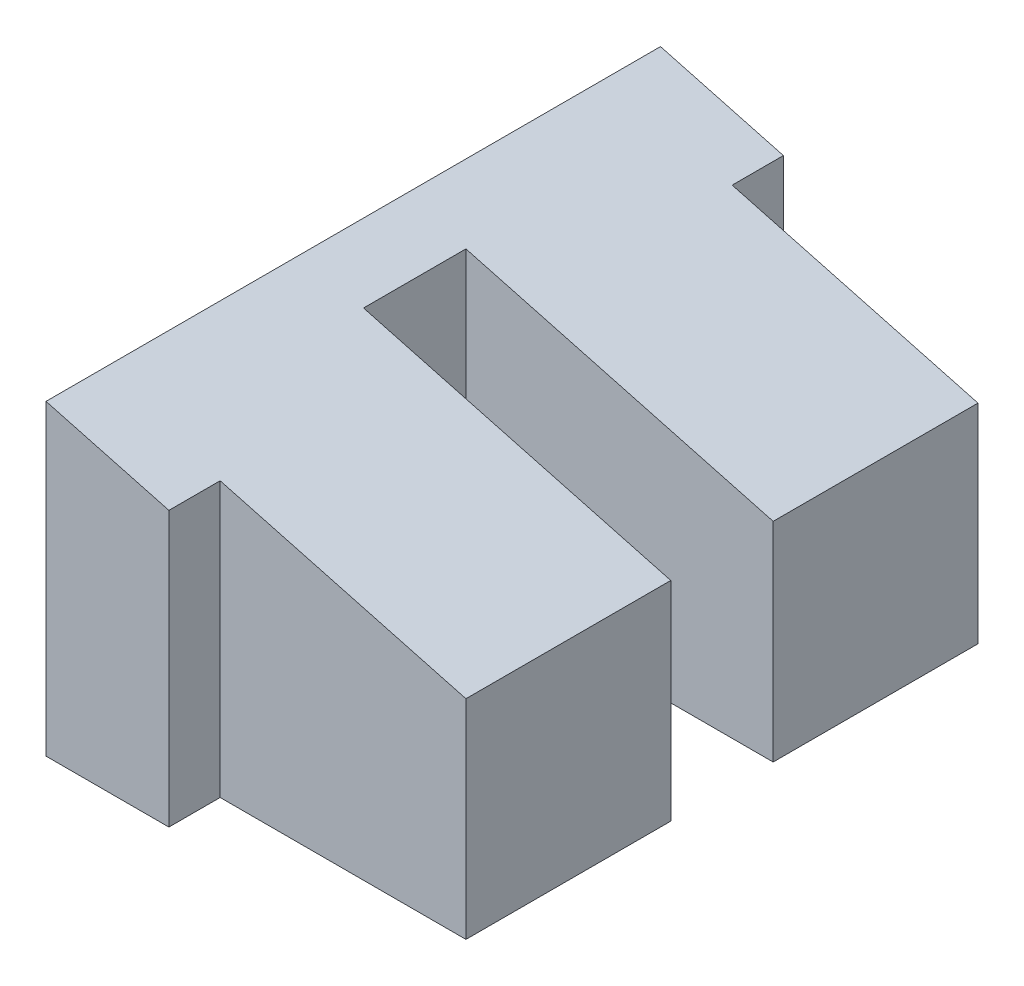
ISO-10303-21;
HEADER;
FILE_DESCRIPTION(('STEP AP214'),'2;1');
FILE_NAME('part.step','',(''),(''),'','','');
FILE_SCHEMA(('AUTOMOTIVE_DESIGN { 1 0 10303 214 1 1 1 1 }'));
ENDSEC;
DATA;
#1=APPLICATION_CONTEXT('core data for automotive mechanical design processes');
#2=APPLICATION_PROTOCOL_DEFINITION('international standard','automotive_design',2000,#1);
#3=PRODUCT_CONTEXT('',#1,'mechanical');
#4=PRODUCT('Part','Part','',(#3));
#5=PRODUCT_RELATED_PRODUCT_CATEGORY('part','',(#4));
#6=PRODUCT_DEFINITION_FORMATION('','',#4);
#7=PRODUCT_DEFINITION_CONTEXT('part definition',#1,'design');
#8=PRODUCT_DEFINITION('design','',#6,#7);
#9=PRODUCT_DEFINITION_SHAPE('','',#8);
#10=(LENGTH_UNIT() NAMED_UNIT(*) SI_UNIT(.MILLI.,.METRE.));
#11=(NAMED_UNIT(*) PLANE_ANGLE_UNIT() SI_UNIT($,.RADIAN.));
#12=(NAMED_UNIT(*) SI_UNIT($,.STERADIAN.) SOLID_ANGLE_UNIT());
#13=UNCERTAINTY_MEASURE_WITH_UNIT(LENGTH_MEASURE(1.E-05),#10,'distance_accuracy_value','');
#14=(GEOMETRIC_REPRESENTATION_CONTEXT(3) GLOBAL_UNCERTAINTY_ASSIGNED_CONTEXT((#13)) GLOBAL_UNIT_ASSIGNED_CONTEXT((#10,
#11,#12)) REPRESENTATION_CONTEXT('',''));
#15=CARTESIAN_POINT('',(0.,0.,0.));
#16=DIRECTION('',(0.,0.,1.));
#17=DIRECTION('',(1.,0.,0.));
#18=AXIS2_PLACEMENT_3D('',#15,#16,#17);
#19=CARTESIAN_POINT('',(10.,0.,0.));
#20=DIRECTION('',(1.,0.,0.));
#21=DIRECTION('',(0.,0.,-1.));
#22=AXIS2_PLACEMENT_3D('',#19,#20,#21);
#23=PLANE('',#22);
#24=DIRECTION('',(0.,1.,0.));
#25=VECTOR('',#24,1.);
#26=CARTESIAN_POINT('',(10.,25.,-25.));
#27=LINE('',#26,#25);
#28=CARTESIAN_POINT('',(10.,0.,-25.));
#29=VERTEX_POINT('',#28);
#30=CARTESIAN_POINT('',(10.,22.3205080756888,-25.));
#31=VERTEX_POINT('',#30);
#32=EDGE_CURVE('E204',#29,#31,#27,.T.);
#33=ORIENTED_EDGE('',*,*,#32,.T.);
#34=DIRECTION('',(0.,0.,1.));
#35=VECTOR('',#34,1.);
#36=CARTESIAN_POINT('',(10.,22.3205080756888,0.));
#37=LINE('',#36,#35);
#38=CARTESIAN_POINT('',(10.,22.3205080756888,-20.835));
#39=VERTEX_POINT('',#38);
#40=EDGE_CURVE('E157',#31,#39,#37,.T.);
#41=ORIENTED_EDGE('',*,*,#40,.T.);
#42=DIRECTION('',(0.,1.,0.));
#43=VECTOR('',#42,1.);
#44=CARTESIAN_POINT('',(10.,25.,-20.835));
#45=LINE('',#44,#43);
#46=CARTESIAN_POINT('',(10.,0.,-20.835));
#47=VERTEX_POINT('',#46);
#48=EDGE_CURVE('E174',#47,#39,#45,.T.);
#49=ORIENTED_EDGE('',*,*,#48,.F.);
#50=DIRECTION('',(0.,0.,-1.));
#51=VECTOR('',#50,1.);
#52=CARTESIAN_POINT('',(10.,0.,25.));
#53=LINE('',#52,#51);
#54=EDGE_CURVE('E199',#47,#29,#53,.T.);
#55=ORIENTED_EDGE('',*,*,#54,.T.);
#56=EDGE_LOOP('',(#33,#41,#49,#55));
#57=FACE_BOUND('',#56,.T.);
#58=ADVANCED_FACE('F36',(#57),#23,.T.);
#59=DIRECTION('',(0.,-1.,0.));
#60=VECTOR('',#59,1.);
#61=CARTESIAN_POINT('',(10.,25.,20.83));
#62=LINE('',#61,#60);
#63=CARTESIAN_POINT('',(10.,22.3205080756888,20.83));
#64=VERTEX_POINT('',#63);
#65=CARTESIAN_POINT('',(10.,0.,20.83));
#66=VERTEX_POINT('',#65);
#67=EDGE_CURVE('E187',#64,#66,#62,.T.);
#68=ORIENTED_EDGE('',*,*,#67,.F.);
#69=DIRECTION('',(0.,0.,1.));
#70=VECTOR('',#69,1.);
#71=CARTESIAN_POINT('',(10.,22.3205080756888,0.));
#72=LINE('',#71,#70);
#73=CARTESIAN_POINT('',(10.,22.3205080756888,25.));
#74=VERTEX_POINT('',#73);
#75=EDGE_CURVE('E59',#64,#74,#72,.T.);
#76=ORIENTED_EDGE('',*,*,#75,.T.);
#77=DIRECTION('',(0.,-1.,0.));
#78=VECTOR('',#77,1.);
#79=CARTESIAN_POINT('',(10.,25.,25.));
#80=LINE('',#79,#78);
#81=CARTESIAN_POINT('',(10.,0.,25.));
#82=VERTEX_POINT('',#81);
#83=EDGE_CURVE('E197',#74,#82,#80,.T.);
#84=ORIENTED_EDGE('',*,*,#83,.T.);
#85=EDGE_CURVE('E201',#82,#66,#53,.T.);
#86=ORIENTED_EDGE('',*,*,#85,.T.);
#87=EDGE_LOOP('',(#68,#76,#84,#86));
#88=FACE_BOUND('',#87,.T.);
#89=ADVANCED_FACE('F244',(#88),#23,.T.);
#90=CARTESIAN_POINT('',(10.,25.,25.));
#91=DIRECTION('',(0.,0.,-1.));
#92=DIRECTION('',(0.,1.,0.));
#93=AXIS2_PLACEMENT_3D('',#90,#91,#92);
#94=PLANE('',#93);
#95=DIRECTION('',(0.96592582628907,-0.258819045102514,0.));
#96=VECTOR('',#95,1.);
#97=CARTESIAN_POINT('',(9.33012701892223,22.5000000000001,25.));
#98=LINE('',#97,#96);
#99=CARTESIAN_POINT('',(0.,25.,25.));
#100=VERTEX_POINT('',#99);
#101=EDGE_CURVE('E171',#100,#74,#98,.T.);
#102=ORIENTED_EDGE('',*,*,#101,.F.);
#103=DIRECTION('',(0.,-1.,0.));
#104=VECTOR('',#103,1.);
#105=CARTESIAN_POINT('',(0.,25.,25.));
#106=LINE('',#105,#104);
#107=CARTESIAN_POINT('',(0.,0.,25.));
#108=VERTEX_POINT('',#107);
#109=EDGE_CURVE('E196',#100,#108,#106,.T.);
#110=ORIENTED_EDGE('',*,*,#109,.T.);
#111=DIRECTION('',(-1.,0.,0.));
#112=VECTOR('',#111,1.);
#113=CARTESIAN_POINT('',(10.,0.,25.));
#114=LINE('',#113,#112);
#115=EDGE_CURVE('E218',#82,#108,#114,.T.);
#116=ORIENTED_EDGE('',*,*,#115,.F.);
#117=ORIENTED_EDGE('',*,*,#83,.F.);
#118=EDGE_LOOP('',(#102,#110,#116,#117));
#119=FACE_BOUND('',#118,.T.);
#120=ADVANCED_FACE('F38',(#119),#94,.F.);
#121=CARTESIAN_POINT('',(10.,25.,-25.));
#122=DIRECTION('',(0.,0.,1.));
#123=DIRECTION('',(0.,-1.,0.));
#124=AXIS2_PLACEMENT_3D('',#121,#122,#123);
#125=PLANE('',#124);
#126=DIRECTION('',(-0.96592582628907,0.258819045102514,0.));
#127=VECTOR('',#126,1.);
#128=CARTESIAN_POINT('',(9.33012701892222,22.5000000000001,-25.));
#129=LINE('',#128,#127);
#130=CARTESIAN_POINT('',(0.,25.,-25.));
#131=VERTEX_POINT('',#130);
#132=EDGE_CURVE('E160',#31,#131,#129,.T.);
#133=ORIENTED_EDGE('',*,*,#132,.F.);
#134=ORIENTED_EDGE('',*,*,#32,.F.);
#135=DIRECTION('',(-1.,0.,0.));
#136=VECTOR('',#135,1.);
#137=CARTESIAN_POINT('',(10.,0.,-25.));
#138=LINE('',#137,#136);
#139=CARTESIAN_POINT('',(0.,0.,-25.));
#140=VERTEX_POINT('',#139);
#141=EDGE_CURVE('E207',#29,#140,#138,.T.);
#142=ORIENTED_EDGE('',*,*,#141,.T.);
#143=DIRECTION('',(0.,1.,0.));
#144=VECTOR('',#143,1.);
#145=CARTESIAN_POINT('',(0.,25.,-25.));
#146=LINE('',#145,#144);
#147=EDGE_CURVE('E212',#140,#131,#146,.T.);
#148=ORIENTED_EDGE('',*,*,#147,.T.);
#149=EDGE_LOOP('',(#133,#134,#142,#148));
#150=FACE_BOUND('',#149,.T.);
#151=ADVANCED_FACE('F235',(#150),#125,.F.);
#152=CARTESIAN_POINT('',(30.,25.,20.83));
#153=DIRECTION('',(0.,0.,-1.));
#154=DIRECTION('',(0.,1.,0.));
#155=AXIS2_PLACEMENT_3D('',#152,#153,#154);
#156=PLANE('',#155);
#157=DIRECTION('',(0.96592582628907,-0.258819045102514,0.));
#158=VECTOR('',#157,1.);
#159=CARTESIAN_POINT('',(27.9903810567667,17.5000000000002,20.83));
#160=LINE('',#159,#158);
#161=CARTESIAN_POINT('',(30.,16.9615242270665,20.83));
#162=VERTEX_POINT('',#161);
#163=EDGE_CURVE('E167',#64,#162,#160,.T.);
#164=ORIENTED_EDGE('',*,*,#163,.F.);
#165=ORIENTED_EDGE('',*,*,#67,.T.);
#166=DIRECTION('',(-1.,0.,0.));
#167=VECTOR('',#166,1.);
#168=CARTESIAN_POINT('',(30.,0.,20.83));
#169=LINE('',#168,#167);
#170=CARTESIAN_POINT('',(30.,0.,20.83));
#171=VERTEX_POINT('',#170);
#172=EDGE_CURVE('E136',#171,#66,#169,.T.);
#173=ORIENTED_EDGE('',*,*,#172,.F.);
#174=DIRECTION('',(0.,-1.,0.));
#175=VECTOR('',#174,1.);
#176=CARTESIAN_POINT('',(30.,25.,20.83));
#177=LINE('',#176,#175);
#178=EDGE_CURVE('E188',#162,#171,#177,.T.);
#179=ORIENTED_EDGE('',*,*,#178,.F.);
#180=EDGE_LOOP('',(#164,#165,#173,#179));
#181=FACE_BOUND('',#180,.T.);
#182=ADVANCED_FACE('F248',(#181),#156,.F.);
#183=CARTESIAN_POINT('',(30.,25.,4.16333333333334));
#184=DIRECTION('',(0.,0.,1.));
#185=DIRECTION('',(0.,-1.,0.));
#186=AXIS2_PLACEMENT_3D('',#183,#184,#185);
#187=PLANE('',#186);
#188=DIRECTION('',(-0.96592582628907,0.258819045102514,0.));
#189=VECTOR('',#188,1.);
#190=CARTESIAN_POINT('',(27.9903810567667,17.5000000000002,4.16333333333334));
#191=LINE('',#190,#189);
#192=CARTESIAN_POINT('',(30.,16.9615242270665,4.16333333333334));
#193=VERTEX_POINT('',#192);
#194=CARTESIAN_POINT('',(5.,23.6602540378444,4.16333333333335));
#195=VERTEX_POINT('',#194);
#196=EDGE_CURVE('E51',#193,#195,#191,.T.);
#197=ORIENTED_EDGE('',*,*,#196,.F.);
#198=DIRECTION('',(0.,1.,0.));
#199=VECTOR('',#198,1.);
#200=CARTESIAN_POINT('',(30.,25.,4.16333333333334));
#201=LINE('',#200,#199);
#202=CARTESIAN_POINT('',(30.,0.,4.16333333333333));
#203=VERTEX_POINT('',#202);
#204=EDGE_CURVE('E132',#203,#193,#201,.T.);
#205=ORIENTED_EDGE('',*,*,#204,.F.);
#206=DIRECTION('',(-1.,0.,0.));
#207=VECTOR('',#206,1.);
#208=CARTESIAN_POINT('',(30.,0.,4.16333333333333));
#209=LINE('',#208,#207);
#210=CARTESIAN_POINT('',(5.,0.,4.16333333333334));
#211=VERTEX_POINT('',#210);
#212=EDGE_CURVE('E127',#203,#211,#209,.T.);
#213=ORIENTED_EDGE('',*,*,#212,.T.);
#214=DIRECTION('',(0.,-1.,0.));
#215=VECTOR('',#214,1.);
#216=CARTESIAN_POINT('',(5.,25.,4.16333333333334));
#217=LINE('',#216,#215);
#218=EDGE_CURVE('E130',#195,#211,#217,.T.);
#219=ORIENTED_EDGE('',*,*,#218,.F.);
#220=EDGE_LOOP('',(#197,#205,#213,#219));
#221=FACE_BOUND('',#220,.T.);
#222=ADVANCED_FACE('F129',(#221),#187,.F.);
#223=CARTESIAN_POINT('',(30.,25.,-4.16833333333333));
#224=DIRECTION('',(0.,0.,-1.));
#225=DIRECTION('',(0.,1.,0.));
#226=AXIS2_PLACEMENT_3D('',#223,#224,#225);
#227=PLANE('',#226);
#228=DIRECTION('',(0.96592582628907,-0.258819045102514,0.));
#229=VECTOR('',#228,1.);
#230=CARTESIAN_POINT('',(27.9903810567667,17.5000000000002,-4.16833333333333));
#231=LINE('',#230,#229);
#232=CARTESIAN_POINT('',(5.,23.6602540378444,-4.16833333333333));
#233=VERTEX_POINT('',#232);
#234=CARTESIAN_POINT('',(30.,16.9615242270665,-4.16833333333333));
#235=VERTEX_POINT('',#234);
#236=EDGE_CURVE('E163',#233,#235,#231,.T.);
#237=ORIENTED_EDGE('',*,*,#236,.F.);
#238=DIRECTION('',(0.,-1.,0.));
#239=VECTOR('',#238,1.);
#240=CARTESIAN_POINT('',(5.,25.,-4.16833333333333));
#241=LINE('',#240,#239);
#242=CARTESIAN_POINT('',(5.,0.,-4.16833333333333));
#243=VERTEX_POINT('',#242);
#244=EDGE_CURVE('E143',#233,#243,#241,.T.);
#245=ORIENTED_EDGE('',*,*,#244,.T.);
#246=DIRECTION('',(-1.,0.,0.));
#247=VECTOR('',#246,1.);
#248=CARTESIAN_POINT('',(30.,0.,-4.16833333333333));
#249=LINE('',#248,#247);
#250=CARTESIAN_POINT('',(30.,0.,-4.16833333333333));
#251=VERTEX_POINT('',#250);
#252=EDGE_CURVE('E148',#251,#243,#249,.T.);
#253=ORIENTED_EDGE('',*,*,#252,.F.);
#254=DIRECTION('',(0.,-1.,0.));
#255=VECTOR('',#254,1.);
#256=CARTESIAN_POINT('',(30.,25.,-4.16833333333333));
#257=LINE('',#256,#255);
#258=EDGE_CURVE('E175',#235,#251,#257,.T.);
#259=ORIENTED_EDGE('',*,*,#258,.F.);
#260=EDGE_LOOP('',(#237,#245,#253,#259));
#261=FACE_BOUND('',#260,.T.);
#262=ADVANCED_FACE('F273',(#261),#227,.F.);
#263=CARTESIAN_POINT('',(30.,25.,-20.835));
#264=DIRECTION('',(0.,0.,1.));
#265=DIRECTION('',(0.,-1.,0.));
#266=AXIS2_PLACEMENT_3D('',#263,#264,#265);
#267=PLANE('',#266);
#268=DIRECTION('',(-0.96592582628907,0.258819045102514,0.));
#269=VECTOR('',#268,1.);
#270=CARTESIAN_POINT('',(27.9903810567667,17.5000000000002,-20.835));
#271=LINE('',#270,#269);
#272=CARTESIAN_POINT('',(30.,16.9615242270665,-20.835));
#273=VERTEX_POINT('',#272);
#274=EDGE_CURVE('E44',#273,#39,#271,.T.);
#275=ORIENTED_EDGE('',*,*,#274,.F.);
#276=DIRECTION('',(0.,1.,0.));
#277=VECTOR('',#276,1.);
#278=CARTESIAN_POINT('',(30.,25.,-20.835));
#279=LINE('',#278,#277);
#280=CARTESIAN_POINT('',(30.,0.,-20.835));
#281=VERTEX_POINT('',#280);
#282=EDGE_CURVE('E179',#281,#273,#279,.T.);
#283=ORIENTED_EDGE('',*,*,#282,.F.);
#284=DIRECTION('',(-1.,0.,0.));
#285=VECTOR('',#284,1.);
#286=CARTESIAN_POINT('',(30.,0.,-20.835));
#287=LINE('',#286,#285);
#288=EDGE_CURVE('E182',#281,#47,#287,.T.);
#289=ORIENTED_EDGE('',*,*,#288,.T.);
#290=ORIENTED_EDGE('',*,*,#48,.T.);
#291=EDGE_LOOP('',(#275,#283,#289,#290));
#292=FACE_BOUND('',#291,.T.);
#293=ADVANCED_FACE('F225',(#292),#267,.F.);
#294=CARTESIAN_POINT('',(10.,0.,25.));
#295=DIRECTION('',(0.,1.,0.));
#296=DIRECTION('',(0.,0.,1.));
#297=AXIS2_PLACEMENT_3D('',#294,#295,#296);
#298=PLANE('',#297);
#299=ORIENTED_EDGE('',*,*,#252,.T.);
#300=DIRECTION('',(0.,0.,-1.));
#301=VECTOR('',#300,1.);
#302=CARTESIAN_POINT('',(5.,0.,4.16333333333334));
#303=LINE('',#302,#301);
#304=EDGE_CURVE('E142',#211,#243,#303,.T.);
#305=ORIENTED_EDGE('',*,*,#304,.F.);
#306=ORIENTED_EDGE('',*,*,#212,.F.);
#307=DIRECTION('',(0.,0.,-1.));
#308=VECTOR('',#307,1.);
#309=CARTESIAN_POINT('',(30.,0.,20.83));
#310=LINE('',#309,#308);
#311=EDGE_CURVE('E190',#171,#203,#310,.T.);
#312=ORIENTED_EDGE('',*,*,#311,.F.);
#313=ORIENTED_EDGE('',*,*,#172,.T.);
#314=ORIENTED_EDGE('',*,*,#85,.F.);
#315=ORIENTED_EDGE('',*,*,#115,.T.);
#316=DIRECTION('',(0.,0.,-1.));
#317=VECTOR('',#316,1.);
#318=CARTESIAN_POINT('',(0.,0.,25.));
#319=LINE('',#318,#317);
#320=EDGE_CURVE('E210',#108,#140,#319,.T.);
#321=ORIENTED_EDGE('',*,*,#320,.T.);
#322=ORIENTED_EDGE('',*,*,#141,.F.);
#323=ORIENTED_EDGE('',*,*,#54,.F.);
#324=ORIENTED_EDGE('',*,*,#288,.F.);
#325=DIRECTION('',(0.,0.,-1.));
#326=VECTOR('',#325,1.);
#327=CARTESIAN_POINT('',(30.,0.,-4.16833333333333));
#328=LINE('',#327,#326);
#329=EDGE_CURVE('E177',#251,#281,#328,.T.);
#330=ORIENTED_EDGE('',*,*,#329,.F.);
#331=EDGE_LOOP('',(#299,#305,#306,#312,#313,#314,#315,#321,#322,#323,#324,#330));
#332=FACE_BOUND('',#331,.T.);
#333=ADVANCED_FACE('F145',(#332),#298,.F.);
#334=CARTESIAN_POINT('',(0.,0.,0.));
#335=DIRECTION('',(1.,0.,0.));
#336=DIRECTION('',(0.,0.,-1.));
#337=AXIS2_PLACEMENT_3D('',#334,#335,#336);
#338=PLANE('',#337);
#339=ORIENTED_EDGE('',*,*,#109,.F.);
#340=DIRECTION('',(0.,0.,1.));
#341=VECTOR('',#340,1.);
#342=CARTESIAN_POINT('',(0.,25.,25.));
#343=LINE('',#342,#341);
#344=EDGE_CURVE('E200',#131,#100,#343,.T.);
#345=ORIENTED_EDGE('',*,*,#344,.F.);
#346=ORIENTED_EDGE('',*,*,#147,.F.);
#347=ORIENTED_EDGE('',*,*,#320,.F.);
#348=EDGE_LOOP('',(#339,#345,#346,#347));
#349=FACE_BOUND('',#348,.T.);
#350=ADVANCED_FACE('F240',(#349),#338,.F.);
#351=CARTESIAN_POINT('',(30.,0.,0.));
#352=DIRECTION('',(1.,0.,0.));
#353=DIRECTION('',(0.,0.,-1.));
#354=AXIS2_PLACEMENT_3D('',#351,#352,#353);
#355=PLANE('',#354);
#356=DIRECTION('',(0.,0.,-1.));
#357=VECTOR('',#356,1.);
#358=CARTESIAN_POINT('',(30.,16.9615242270665,140.764026294476));
#359=LINE('',#358,#357);
#360=EDGE_CURVE('E156',#162,#193,#359,.T.);
#361=ORIENTED_EDGE('',*,*,#360,.F.);
#362=ORIENTED_EDGE('',*,*,#178,.T.);
#363=ORIENTED_EDGE('',*,*,#311,.T.);
#364=ORIENTED_EDGE('',*,*,#204,.T.);
#365=EDGE_LOOP('',(#361,#362,#363,#364));
#366=FACE_BOUND('',#365,.T.);
#367=ADVANCED_FACE('F250',(#366),#355,.T.);
#368=CARTESIAN_POINT('',(30.,0.,0.));
#369=DIRECTION('',(1.,0.,0.));
#370=DIRECTION('',(0.,0.,-1.));
#371=AXIS2_PLACEMENT_3D('',#368,#369,#370);
#372=PLANE('',#371);
#373=EDGE_CURVE('E152',#235,#273,#359,.T.);
#374=ORIENTED_EDGE('',*,*,#373,.F.);
#375=ORIENTED_EDGE('',*,*,#258,.T.);
#376=ORIENTED_EDGE('',*,*,#329,.T.);
#377=ORIENTED_EDGE('',*,*,#282,.T.);
#378=EDGE_LOOP('',(#374,#375,#376,#377));
#379=FACE_BOUND('',#378,.T.);
#380=ADVANCED_FACE('F227',(#379),#372,.T.);
#381=CARTESIAN_POINT('',(0.,25.,140.764026294476));
#382=DIRECTION('',(0.258819045102514,0.96592582628907,0.));
#383=DIRECTION('',(-0.96592582628907,0.258819045102514,0.));
#384=AXIS2_PLACEMENT_3D('',#381,#382,#383);
#385=PLANE('',#384);
#386=DIRECTION('',(0.,0.,1.));
#387=VECTOR('',#386,1.);
#388=CARTESIAN_POINT('',(4.99999999999999,23.6602540378444,140.764026294476));
#389=LINE('',#388,#387);
#390=EDGE_CURVE('E11',#233,#195,#389,.T.);
#391=ORIENTED_EDGE('',*,*,#390,.F.);
#392=ORIENTED_EDGE('',*,*,#236,.T.);
#393=ORIENTED_EDGE('',*,*,#373,.T.);
#394=ORIENTED_EDGE('',*,*,#274,.T.);
#395=ORIENTED_EDGE('',*,*,#40,.F.);
#396=ORIENTED_EDGE('',*,*,#132,.T.);
#397=ORIENTED_EDGE('',*,*,#344,.T.);
#398=ORIENTED_EDGE('',*,*,#101,.T.);
#399=ORIENTED_EDGE('',*,*,#75,.F.);
#400=ORIENTED_EDGE('',*,*,#163,.T.);
#401=ORIENTED_EDGE('',*,*,#360,.T.);
#402=ORIENTED_EDGE('',*,*,#196,.T.);
#403=EDGE_LOOP('',(#391,#392,#393,#394,#395,#396,#397,#398,#399,#400,#401,#402));
#404=FACE_BOUND('',#403,.T.);
#405=ADVANCED_FACE('F222',(#404),#385,.T.);
#406=CARTESIAN_POINT('',(5.,25.,4.16333333333334));
#407=DIRECTION('',(-1.,0.,0.));
#408=DIRECTION('',(0.,0.,1.));
#409=AXIS2_PLACEMENT_3D('',#406,#407,#408);
#410=PLANE('',#409);
#411=ORIENTED_EDGE('',*,*,#390,.T.);
#412=ORIENTED_EDGE('',*,*,#218,.T.);
#413=ORIENTED_EDGE('',*,*,#304,.T.);
#414=ORIENTED_EDGE('',*,*,#244,.F.);
#415=EDGE_LOOP('',(#411,#412,#413,#414));
#416=FACE_BOUND('',#415,.T.);
#417=ADVANCED_FACE('F140',(#416),#410,.F.);
#418=CLOSED_SHELL('',(#58,#89,#120,#151,#182,#222,#262,#293,#333,#350,#367,#380,#405,#417));
#419=MANIFOLD_SOLID_BREP('B2',#418);
#420=ADVANCED_BREP_SHAPE_REPRESENTATION('',(#18,#419),#14);
#421=SHAPE_DEFINITION_REPRESENTATION(#9,#420);
ENDSEC;
END-ISO-10303-21;
